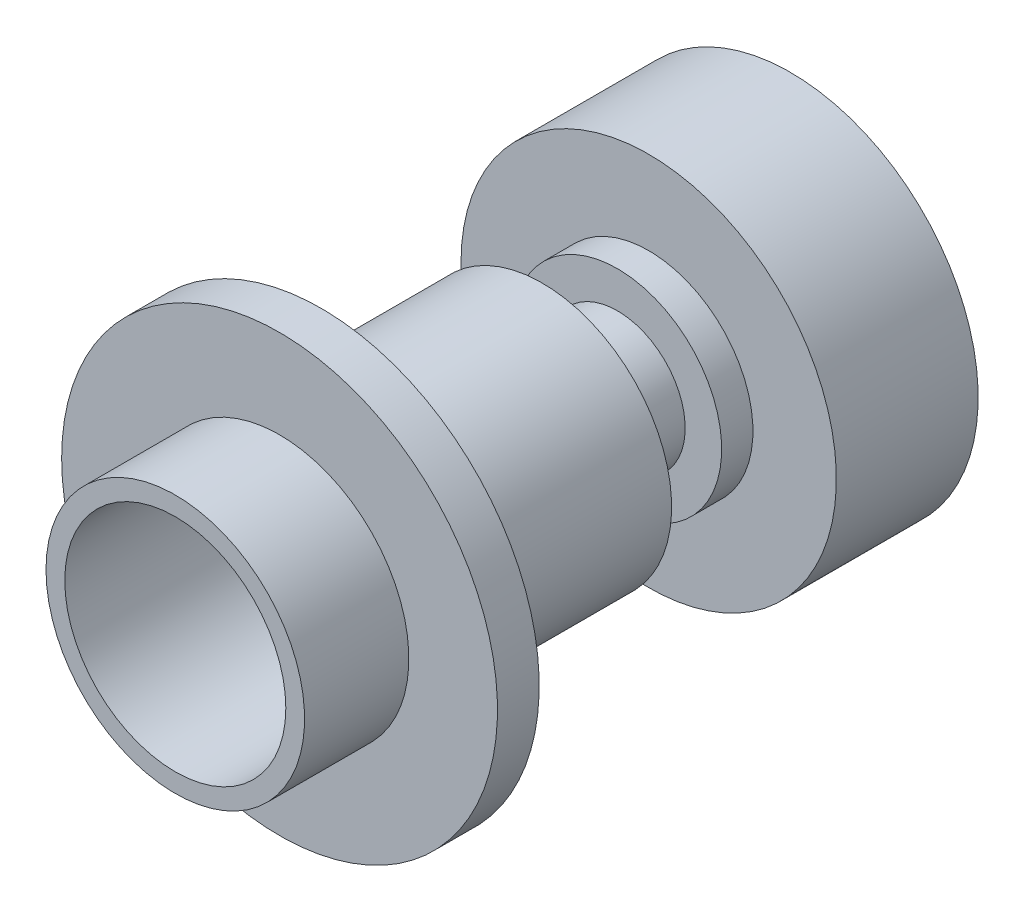
ISO-10303-21;
HEADER;
FILE_DESCRIPTION(('STEP AP214'),'2;1');
FILE_NAME('part.step','',(''),(''),'','','');
FILE_SCHEMA(('AUTOMOTIVE_DESIGN { 1 0 10303 214 1 1 1 1 }'));
ENDSEC;
DATA;
#1=APPLICATION_CONTEXT('core data for automotive mechanical design processes');
#2=APPLICATION_PROTOCOL_DEFINITION('international standard','automotive_design',2000,#1);
#3=PRODUCT_CONTEXT('',#1,'mechanical');
#4=PRODUCT('Part','Part','',(#3));
#5=PRODUCT_RELATED_PRODUCT_CATEGORY('part','',(#4));
#6=PRODUCT_DEFINITION_FORMATION('','',#4);
#7=PRODUCT_DEFINITION_CONTEXT('part definition',#1,'design');
#8=PRODUCT_DEFINITION('design','',#6,#7);
#9=PRODUCT_DEFINITION_SHAPE('','',#8);
#10=(LENGTH_UNIT() NAMED_UNIT(*) SI_UNIT(.MILLI.,.METRE.));
#11=(NAMED_UNIT(*) PLANE_ANGLE_UNIT() SI_UNIT($,.RADIAN.));
#12=(NAMED_UNIT(*) SI_UNIT($,.STERADIAN.) SOLID_ANGLE_UNIT());
#13=UNCERTAINTY_MEASURE_WITH_UNIT(LENGTH_MEASURE(1.E-05),#10,'distance_accuracy_value','');
#14=(GEOMETRIC_REPRESENTATION_CONTEXT(3) GLOBAL_UNCERTAINTY_ASSIGNED_CONTEXT((#13)) GLOBAL_UNIT_ASSIGNED_CONTEXT((#10,
#11,#12)) REPRESENTATION_CONTEXT('',''));
#15=CARTESIAN_POINT('',(0.,0.,0.));
#16=DIRECTION('',(0.,0.,1.));
#17=DIRECTION('',(1.,0.,0.));
#18=AXIS2_PLACEMENT_3D('',#15,#16,#17);
#19=CARTESIAN_POINT('',(2.5,0.,3.4));
#20=DIRECTION('',(0.,0.,1.));
#21=DIRECTION('',(1.,0.,0.));
#22=AXIS2_PLACEMENT_3D('',#19,#20,#21);
#23=PLANE('',#22);
#24=CARTESIAN_POINT('',(0.,0.,3.4));
#25=DIRECTION('',(0.,0.,-1.));
#26=DIRECTION('',(-1.,0.,0.));
#27=AXIS2_PLACEMENT_3D('',#24,#25,#26);
#28=CIRCLE('',#27,0.25);
#29=CARTESIAN_POINT('',(-0.25,0.,3.4));
#30=VERTEX_POINT('',#29);
#31=EDGE_CURVE('E73',#30,#30,#28,.T.);
#32=ORIENTED_EDGE('',*,*,#31,.F.);
#33=EDGE_LOOP('',(#32));
#34=FACE_BOUND('',#33,.T.);
#35=CARTESIAN_POINT('',(0.,0.,3.4));
#36=DIRECTION('',(0.,0.,-1.));
#37=DIRECTION('',(-1.,0.,0.));
#38=AXIS2_PLACEMENT_3D('',#35,#36,#37);
#39=CIRCLE('',#38,0.8);
#40=CARTESIAN_POINT('',(-0.799999999999999,0.,3.4));
#41=VERTEX_POINT('',#40);
#42=EDGE_CURVE('E91',#41,#41,#39,.T.);
#43=ORIENTED_EDGE('',*,*,#42,.T.);
#44=EDGE_LOOP('',(#43));
#45=FACE_BOUND('',#44,.T.);
#46=ADVANCED_FACE('F32',(#34,#45),#23,.F.);
#47=CARTESIAN_POINT('',(0.,0.,0.));
#48=DIRECTION('',(0.,0.,-1.));
#49=DIRECTION('',(-1.,0.,0.));
#50=AXIS2_PLACEMENT_3D('',#47,#48,#49);
#51=CYLINDRICAL_SURFACE('',#50,2.65);
#52=CARTESIAN_POINT('',(0.,0.,14.75));
#53=DIRECTION('',(0.,0.,-1.));
#54=DIRECTION('',(-1.,0.,0.));
#55=AXIS2_PLACEMENT_3D('',#52,#53,#54);
#56=CIRCLE('',#55,2.65);
#57=CARTESIAN_POINT('',(-2.65,0.,14.75));
#58=VERTEX_POINT('',#57);
#59=EDGE_CURVE('E10',#58,#58,#56,.T.);
#60=ORIENTED_EDGE('',*,*,#59,.F.);
#61=EDGE_LOOP('',(#60));
#62=FACE_BOUND('',#61,.T.);
#63=CARTESIAN_POINT('',(0.,0.,6.60505517197854));
#64=DIRECTION('',(0.,0.,-1.));
#65=DIRECTION('',(-1.,0.,0.));
#66=AXIS2_PLACEMENT_3D('',#63,#64,#65);
#67=CIRCLE('',#66,2.65);
#68=CARTESIAN_POINT('',(2.65,0.,6.60505517197854));
#69=VERTEX_POINT('',#68);
#70=EDGE_CURVE('E79',#69,#69,#67,.T.);
#71=ORIENTED_EDGE('',*,*,#70,.T.);
#72=EDGE_LOOP('',(#71));
#73=FACE_BOUND('',#72,.T.);
#74=ADVANCED_FACE('F34',(#62,#73),#51,.F.);
#75=CARTESIAN_POINT('',(2.65,0.,14.75));
#76=DIRECTION('',(0.,0.,-1.));
#77=DIRECTION('',(-1.,0.,0.));
#78=AXIS2_PLACEMENT_3D('',#75,#76,#77);
#79=PLANE('',#78);
#80=CARTESIAN_POINT('',(0.,0.,14.75));
#81=DIRECTION('',(0.,0.,-1.));
#82=DIRECTION('',(-1.,0.,0.));
#83=AXIS2_PLACEMENT_3D('',#80,#81,#82);
#84=CIRCLE('',#83,3.1);
#85=CARTESIAN_POINT('',(-3.1,0.,14.75));
#86=VERTEX_POINT('',#85);
#87=EDGE_CURVE('E39',#86,#86,#84,.T.);
#88=ORIENTED_EDGE('',*,*,#87,.F.);
#89=EDGE_LOOP('',(#88));
#90=FACE_BOUND('',#89,.T.);
#91=ORIENTED_EDGE('',*,*,#59,.T.);
#92=EDGE_LOOP('',(#91));
#93=FACE_BOUND('',#92,.T.);
#94=ADVANCED_FACE('F180',(#90,#93),#79,.F.);
#95=CARTESIAN_POINT('',(0.,0.,0.));
#96=DIRECTION('',(0.,0.,-1.));
#97=DIRECTION('',(-1.,0.,0.));
#98=AXIS2_PLACEMENT_3D('',#95,#96,#97);
#99=CYLINDRICAL_SURFACE('',#98,3.1);
#100=CARTESIAN_POINT('',(0.,0.,12.25));
#101=DIRECTION('',(0.,0.,-1.));
#102=DIRECTION('',(-1.,0.,0.));
#103=AXIS2_PLACEMENT_3D('',#100,#101,#102);
#104=CIRCLE('',#103,3.1);
#105=CARTESIAN_POINT('',(-3.1,0.,12.25));
#106=VERTEX_POINT('',#105);
#107=EDGE_CURVE('E43',#106,#106,#104,.T.);
#108=ORIENTED_EDGE('',*,*,#107,.F.);
#109=EDGE_LOOP('',(#108));
#110=FACE_BOUND('',#109,.T.);
#111=ORIENTED_EDGE('',*,*,#87,.T.);
#112=EDGE_LOOP('',(#111));
#113=FACE_BOUND('',#112,.T.);
#114=ADVANCED_FACE('F175',(#110,#113),#99,.T.);
#115=CARTESIAN_POINT('',(3.1,0.,12.25));
#116=DIRECTION('',(0.,0.,-1.));
#117=DIRECTION('',(-1.,0.,0.));
#118=AXIS2_PLACEMENT_3D('',#115,#116,#117);
#119=PLANE('',#118);
#120=CARTESIAN_POINT('',(0.,0.,12.25));
#121=DIRECTION('',(0.,0.,-1.));
#122=DIRECTION('',(-1.,0.,0.));
#123=AXIS2_PLACEMENT_3D('',#120,#121,#122);
#124=CIRCLE('',#123,5.225);
#125=CARTESIAN_POINT('',(-5.225,0.,12.25));
#126=VERTEX_POINT('',#125);
#127=EDGE_CURVE('E47',#126,#126,#124,.T.);
#128=ORIENTED_EDGE('',*,*,#127,.F.);
#129=EDGE_LOOP('',(#128));
#130=FACE_BOUND('',#129,.T.);
#131=ORIENTED_EDGE('',*,*,#107,.T.);
#132=EDGE_LOOP('',(#131));
#133=FACE_BOUND('',#132,.T.);
#134=ADVANCED_FACE('F169',(#130,#133),#119,.F.);
#135=CARTESIAN_POINT('',(0.,0.,0.));
#136=DIRECTION('',(0.,0.,-1.));
#137=DIRECTION('',(-1.,0.,0.));
#138=AXIS2_PLACEMENT_3D('',#135,#136,#137);
#139=CYLINDRICAL_SURFACE('',#138,5.225);
#140=CARTESIAN_POINT('',(0.,0.,11.25));
#141=DIRECTION('',(0.,0.,-1.));
#142=DIRECTION('',(-1.,0.,0.));
#143=AXIS2_PLACEMENT_3D('',#140,#141,#142);
#144=CIRCLE('',#143,5.225);
#145=CARTESIAN_POINT('',(-5.225,0.,11.25));
#146=VERTEX_POINT('',#145);
#147=EDGE_CURVE('E52',#146,#146,#144,.T.);
#148=ORIENTED_EDGE('',*,*,#147,.F.);
#149=EDGE_LOOP('',(#148));
#150=FACE_BOUND('',#149,.T.);
#151=ORIENTED_EDGE('',*,*,#127,.T.);
#152=EDGE_LOOP('',(#151));
#153=FACE_BOUND('',#152,.T.);
#154=ADVANCED_FACE('F163',(#150,#153),#139,.T.);
#155=CARTESIAN_POINT('',(5.225,0.,11.25));
#156=DIRECTION('',(0.,0.,1.));
#157=DIRECTION('',(1.,0.,0.));
#158=AXIS2_PLACEMENT_3D('',#155,#156,#157);
#159=PLANE('',#158);
#160=CARTESIAN_POINT('',(0.,0.,11.25));
#161=DIRECTION('',(0.,0.,-1.));
#162=DIRECTION('',(-1.,0.,0.));
#163=AXIS2_PLACEMENT_3D('',#160,#161,#162);
#164=CIRCLE('',#163,3.1);
#165=CARTESIAN_POINT('',(-3.1,0.,11.25));
#166=VERTEX_POINT('',#165);
#167=EDGE_CURVE('E55',#166,#166,#164,.T.);
#168=ORIENTED_EDGE('',*,*,#167,.F.);
#169=EDGE_LOOP('',(#168));
#170=FACE_BOUND('',#169,.T.);
#171=ORIENTED_EDGE('',*,*,#147,.T.);
#172=EDGE_LOOP('',(#171));
#173=FACE_BOUND('',#172,.T.);
#174=ADVANCED_FACE('F157',(#170,#173),#159,.F.);
#175=CARTESIAN_POINT('',(0.,0.,0.));
#176=DIRECTION('',(0.,0.,-1.));
#177=DIRECTION('',(-1.,0.,0.));
#178=AXIS2_PLACEMENT_3D('',#175,#176,#177);
#179=CYLINDRICAL_SURFACE('',#178,3.1);
#180=CARTESIAN_POINT('',(0.,0.,5.95));
#181=DIRECTION('',(0.,0.,-1.));
#182=DIRECTION('',(-1.,0.,0.));
#183=AXIS2_PLACEMENT_3D('',#180,#181,#182);
#184=CIRCLE('',#183,3.1);
#185=CARTESIAN_POINT('',(-3.1,0.,5.95));
#186=VERTEX_POINT('',#185);
#187=EDGE_CURVE('E58',#186,#186,#184,.T.);
#188=ORIENTED_EDGE('',*,*,#187,.F.);
#189=EDGE_LOOP('',(#188));
#190=FACE_BOUND('',#189,.T.);
#191=ORIENTED_EDGE('',*,*,#167,.T.);
#192=EDGE_LOOP('',(#191));
#193=FACE_BOUND('',#192,.T.);
#194=ADVANCED_FACE('F151',(#190,#193),#179,.T.);
#195=CARTESIAN_POINT('',(0.,0.,5.95));
#196=DIRECTION('',(0.,0.,1.));
#197=DIRECTION('',(1.,0.,0.));
#198=AXIS2_PLACEMENT_3D('',#195,#196,#197);
#199=CONICAL_SURFACE('',#198,3.1,1.30597899688911);
#200=CARTESIAN_POINT('',(0.,0.,5.55));
#201=DIRECTION('',(0.,0.,-1.));
#202=DIRECTION('',(-1.,0.,0.));
#203=AXIS2_PLACEMENT_3D('',#200,#201,#202);
#204=CIRCLE('',#203,1.625);
#205=CARTESIAN_POINT('',(-1.625,0.,5.55));
#206=VERTEX_POINT('',#205);
#207=EDGE_CURVE('E61',#206,#206,#204,.T.);
#208=ORIENTED_EDGE('',*,*,#207,.F.);
#209=EDGE_LOOP('',(#208));
#210=FACE_BOUND('',#209,.T.);
#211=ORIENTED_EDGE('',*,*,#187,.T.);
#212=EDGE_LOOP('',(#211));
#213=FACE_BOUND('',#212,.T.);
#214=ADVANCED_FACE('F145',(#210,#213),#199,.T.);
#215=CARTESIAN_POINT('',(0.,0.,0.));
#216=DIRECTION('',(0.,0.,-1.));
#217=DIRECTION('',(-1.,0.,0.));
#218=AXIS2_PLACEMENT_3D('',#215,#216,#217);
#219=CYLINDRICAL_SURFACE('',#218,1.625);
#220=CARTESIAN_POINT('',(0.,0.,4.15));
#221=DIRECTION('',(0.,0.,-1.));
#222=DIRECTION('',(-1.,0.,0.));
#223=AXIS2_PLACEMENT_3D('',#220,#221,#222);
#224=CIRCLE('',#223,1.625);
#225=CARTESIAN_POINT('',(-1.625,0.,4.15));
#226=VERTEX_POINT('',#225);
#227=EDGE_CURVE('E64',#226,#226,#224,.T.);
#228=ORIENTED_EDGE('',*,*,#227,.F.);
#229=EDGE_LOOP('',(#228));
#230=FACE_BOUND('',#229,.T.);
#231=ORIENTED_EDGE('',*,*,#207,.T.);
#232=EDGE_LOOP('',(#231));
#233=FACE_BOUND('',#232,.T.);
#234=ADVANCED_FACE('F139',(#230,#233),#219,.T.);
#235=CARTESIAN_POINT('',(1.625,0.,4.15));
#236=DIRECTION('',(0.,0.,-1.));
#237=DIRECTION('',(-1.,0.,0.));
#238=AXIS2_PLACEMENT_3D('',#235,#236,#237);
#239=PLANE('',#238);
#240=CARTESIAN_POINT('',(0.,0.,4.15));
#241=DIRECTION('',(0.,0.,-1.));
#242=DIRECTION('',(-1.,0.,0.));
#243=AXIS2_PLACEMENT_3D('',#240,#241,#242);
#244=CIRCLE('',#243,2.5);
#245=CARTESIAN_POINT('',(-2.5,0.,4.15));
#246=VERTEX_POINT('',#245);
#247=EDGE_CURVE('E67',#246,#246,#244,.T.);
#248=ORIENTED_EDGE('',*,*,#247,.F.);
#249=EDGE_LOOP('',(#248));
#250=FACE_BOUND('',#249,.T.);
#251=ORIENTED_EDGE('',*,*,#227,.T.);
#252=EDGE_LOOP('',(#251));
#253=FACE_BOUND('',#252,.T.);
#254=ADVANCED_FACE('F133',(#250,#253),#239,.F.);
#255=CARTESIAN_POINT('',(0.,0.,0.));
#256=DIRECTION('',(0.,0.,-1.));
#257=DIRECTION('',(-1.,0.,0.));
#258=AXIS2_PLACEMENT_3D('',#255,#256,#257);
#259=CYLINDRICAL_SURFACE('',#258,2.5);
#260=CARTESIAN_POINT('',(0.,0.,3.4));
#261=DIRECTION('',(0.,0.,-1.));
#262=DIRECTION('',(-1.,0.,0.));
#263=AXIS2_PLACEMENT_3D('',#260,#261,#262);
#264=CIRCLE('',#263,2.5);
#265=CARTESIAN_POINT('',(-2.5,0.,3.4));
#266=VERTEX_POINT('',#265);
#267=EDGE_CURVE('E70',#266,#266,#264,.T.);
#268=ORIENTED_EDGE('',*,*,#267,.F.);
#269=EDGE_LOOP('',(#268));
#270=FACE_BOUND('',#269,.T.);
#271=ORIENTED_EDGE('',*,*,#247,.T.);
#272=EDGE_LOOP('',(#271));
#273=FACE_BOUND('',#272,.T.);
#274=ADVANCED_FACE('F129',(#270,#273),#259,.T.);
#275=CARTESIAN_POINT('',(0.,0.,0.));
#276=DIRECTION('',(0.,0.,-1.));
#277=DIRECTION('',(-1.,0.,0.));
#278=AXIS2_PLACEMENT_3D('',#275,#276,#277);
#279=CYLINDRICAL_SURFACE('',#278,0.25);
#280=CARTESIAN_POINT('',(0.,0.,5.95420771435142));
#281=DIRECTION('',(0.,0.,-1.));
#282=DIRECTION('',(-1.,0.,0.));
#283=AXIS2_PLACEMENT_3D('',#280,#281,#282);
#284=CIRCLE('',#283,0.25);
#285=CARTESIAN_POINT('',(0.249999999999999,0.,5.95420771435142));
#286=VERTEX_POINT('',#285);
#287=EDGE_CURVE('E76',#286,#286,#284,.T.);
#288=ORIENTED_EDGE('',*,*,#287,.F.);
#289=EDGE_LOOP('',(#288));
#290=FACE_BOUND('',#289,.T.);
#291=ORIENTED_EDGE('',*,*,#31,.T.);
#292=EDGE_LOOP('',(#291));
#293=FACE_BOUND('',#292,.T.);
#294=ADVANCED_FACE('F132',(#290,#293),#279,.F.);
#295=CARTESIAN_POINT('',(0.,0.,5.95420771435142));
#296=DIRECTION('',(0.,0.,1.));
#297=DIRECTION('',(1.,0.,0.));
#298=AXIS2_PLACEMENT_3D('',#295,#296,#297);
#299=CONICAL_SURFACE('',#298,0.25,1.30597899688911);
#300=CARTESIAN_POINT('',(2.65,0.,6.60505517197854));
#301=CARTESIAN_POINT('',(2.625,0.,6.59827551096159));
#302=CARTESIAN_POINT('',(2.6,0.,6.59149584994464));
#303=CARTESIAN_POINT('',(2.55,0.,6.57793652791074));
#304=CARTESIAN_POINT('',(2.525,0.,6.57115686689379));
#305=CARTESIAN_POINT('',(2.475,0.,6.55759754485989));
#306=CARTESIAN_POINT('',(2.45,0.,6.55081788384294));
#307=CARTESIAN_POINT('',(2.4,0.,6.53725856180904));
#308=CARTESIAN_POINT('',(2.375,0.,6.5304789007921));
#309=CARTESIAN_POINT('',(2.325,0.,6.5169195787582));
#310=CARTESIAN_POINT('',(2.3,0.,6.51013991774125));
#311=CARTESIAN_POINT('',(2.25,0.,6.49658059570735));
#312=CARTESIAN_POINT('',(2.225,0.,6.4898009346904));
#313=CARTESIAN_POINT('',(2.175,0.,6.4762416126565));
#314=CARTESIAN_POINT('',(2.15,0.,6.46946195163955));
#315=CARTESIAN_POINT('',(2.1,0.,6.45590262960565));
#316=CARTESIAN_POINT('',(2.075,0.,6.4491229685887));
#317=CARTESIAN_POINT('',(2.025,0.,6.43556364655481));
#318=CARTESIAN_POINT('',(2.,0.,6.42878398553786));
#319=CARTESIAN_POINT('',(1.95,0.,6.41522466350396));
#320=CARTESIAN_POINT('',(1.925,0.,6.40844500248701));
#321=CARTESIAN_POINT('',(1.875,0.,6.39488568045311));
#322=CARTESIAN_POINT('',(1.85,0.,6.38810601943616));
#323=CARTESIAN_POINT('',(1.8,0.,6.37454669740226));
#324=CARTESIAN_POINT('',(1.775,0.,6.36776703638531));
#325=CARTESIAN_POINT('',(1.725,0.,6.35420771435142));
#326=CARTESIAN_POINT('',(1.7,0.,6.34742805333447));
#327=CARTESIAN_POINT('',(1.65,0.,6.33386873130057));
#328=CARTESIAN_POINT('',(1.625,0.,6.32708907028362));
#329=CARTESIAN_POINT('',(1.575,0.,6.31352974824972));
#330=CARTESIAN_POINT('',(1.55,0.,6.30675008723277));
#331=CARTESIAN_POINT('',(1.5,0.,6.29319076519887));
#332=CARTESIAN_POINT('',(1.475,0.,6.28641110418192));
#333=CARTESIAN_POINT('',(1.425,0.,6.27285178214803));
#334=CARTESIAN_POINT('',(1.4,0.,6.26607212113108));
#335=CARTESIAN_POINT('',(1.35,0.,6.25251279909718));
#336=CARTESIAN_POINT('',(1.325,0.,6.24573313808023));
#337=CARTESIAN_POINT('',(1.275,0.,6.23217381604633));
#338=CARTESIAN_POINT('',(1.25,0.,6.22539415502938));
#339=CARTESIAN_POINT('',(1.2,0.,6.21183483299548));
#340=CARTESIAN_POINT('',(1.175,0.,6.20505517197854));
#341=CARTESIAN_POINT('',(1.125,0.,6.19149584994464));
#342=CARTESIAN_POINT('',(1.1,0.,6.18471618892769));
#343=CARTESIAN_POINT('',(1.05,0.,6.17115686689379));
#344=CARTESIAN_POINT('',(1.025,0.,6.16437720587684));
#345=CARTESIAN_POINT('',(0.974999999999999,0.,6.15081788384294));
#346=CARTESIAN_POINT('',(0.949999999999999,0.,6.14403822282599));
#347=CARTESIAN_POINT('',(0.899999999999999,0.,6.13047890079209));
#348=CARTESIAN_POINT('',(0.874999999999999,0.,6.12369923977514));
#349=CARTESIAN_POINT('',(0.824999999999999,0.,6.11013991774125));
#350=CARTESIAN_POINT('',(0.799999999999999,0.,6.1033602567243));
#351=CARTESIAN_POINT('',(0.749999999999999,0.,6.0898009346904));
#352=CARTESIAN_POINT('',(0.724999999999999,0.,6.08302127367345));
#353=CARTESIAN_POINT('',(0.674999999999999,0.,6.06946195163955));
#354=CARTESIAN_POINT('',(0.649999999999999,0.,6.0626822906226));
#355=CARTESIAN_POINT('',(0.599999999999999,0.,6.0491229685887));
#356=CARTESIAN_POINT('',(0.574999999999999,0.,6.04234330757176));
#357=CARTESIAN_POINT('',(0.524999999999999,0.,6.02878398553786));
#358=CARTESIAN_POINT('',(0.499999999999999,0.,6.02200432452091));
#359=CARTESIAN_POINT('',(0.449999999999999,0.,6.00844500248701));
#360=CARTESIAN_POINT('',(0.424999999999999,0.,6.00166534147006));
#361=CARTESIAN_POINT('',(0.374999999999999,0.,5.98810601943616));
#362=CARTESIAN_POINT('',(0.349999999999999,0.,5.98132635841921));
#363=CARTESIAN_POINT('',(0.299999999999999,0.,5.96776703638531));
#364=CARTESIAN_POINT('',(0.274999999999999,0.,5.96098737536837));
#365=CARTESIAN_POINT('',(0.249999999999999,0.,5.95420771435142));
#366=B_SPLINE_CURVE_WITH_KNOTS('',3,(#300,#301,#302,#303,#304,#305,#306,#307,#308,#309,#310,
#311,#312,#313,#314,#315,#316,#317,#318,#319,#320,#321,#322,#323,#324,#325,#326,#327,#328,#329,
#330,#331,#332,#333,#334,#335,#336,#337,#338,#339,#340,#341,#342,#343,#344,#345,#346,#347,#348,
#349,#350,#351,#352,#353,#354,#355,#356,#357,#358,#359,#360,#361,#362,#363,#364,#365),
.UNSPECIFIED.,.F.,.F.,(4,2,2,2,2,2,2,2,2,2,2,2,2,2,2,2,2,2,2,2,2,2,2,2,2,2,2,2,2,2,2,2,4),(0.,
0.0777089070283618,0.155417814056725,0.233126721085087,0.310835628113449,0.388544535141811,
0.466253442170174,0.543962349198536,0.621671256226898,0.69938016325526,0.777089070283623,
0.854797977311986,0.932506884340348,1.01021579136871,1.08792469839707,1.16563360542544,
1.2433425124538,1.32105141948216,1.39876032651052,1.47646923353888,1.55417814056725,
1.63188704759561,1.70959595462397,1.78730486165233,1.8650137686807,1.94272267570906,
2.02043158273742,2.09814048976578,2.17584939679415,2.25355830382251,2.33126721085087,
2.40897611787923,2.48668502490759),.UNSPECIFIED.);
#367=EDGE_CURVE('BSEAM125',#69,#286,#366,.T.);
#368=ORIENTED_EDGE('',*,*,#70,.F.);
#369=ORIENTED_EDGE('',*,*,#287,.T.);
#370=ORIENTED_EDGE('',*,*,#367,.T.);
#371=ORIENTED_EDGE('',*,*,#367,.F.);
#372=EDGE_LOOP('',(#368,#370,#369,#371));
#373=FACE_BOUND('',#372,.T.);
#374=ADVANCED_FACE('F125',(#373),#299,.F.);
#375=CARTESIAN_POINT('',(4.5,0.,3.4));
#376=DIRECTION('',(0.,0.,-1.));
#377=DIRECTION('',(-1.,0.,0.));
#378=AXIS2_PLACEMENT_3D('',#375,#376,#377);
#379=PLANE('',#378);
#380=CARTESIAN_POINT('',(0.,0.,3.4));
#381=DIRECTION('',(0.,0.,-1.));
#382=DIRECTION('',(-1.,0.,0.));
#383=AXIS2_PLACEMENT_3D('',#380,#381,#382);
#384=CIRCLE('',#383,4.5);
#385=CARTESIAN_POINT('',(-4.5,0.,3.4));
#386=VERTEX_POINT('',#385);
#387=EDGE_CURVE('E88',#386,#386,#384,.T.);
#388=ORIENTED_EDGE('',*,*,#387,.F.);
#389=EDGE_LOOP('',(#388));
#390=FACE_BOUND('',#389,.T.);
#391=ORIENTED_EDGE('',*,*,#267,.T.);
#392=EDGE_LOOP('',(#391));
#393=FACE_BOUND('',#392,.T.);
#394=ADVANCED_FACE('F107',(#390,#393),#379,.F.);
#395=CARTESIAN_POINT('',(0.,0.,0.));
#396=DIRECTION('',(0.,0.,-1.));
#397=DIRECTION('',(-1.,0.,0.));
#398=AXIS2_PLACEMENT_3D('',#395,#396,#397);
#399=CYLINDRICAL_SURFACE('',#398,3.75);
#400=CARTESIAN_POINT('',(0.,0.,2.65));
#401=DIRECTION('',(0.,0.,-1.));
#402=DIRECTION('',(-1.,0.,0.));
#403=AXIS2_PLACEMENT_3D('',#400,#401,#402);
#404=CIRCLE('',#403,3.75);
#405=CARTESIAN_POINT('',(-3.75,0.,2.65));
#406=VERTEX_POINT('',#405);
#407=EDGE_CURVE('E97',#406,#406,#404,.T.);
#408=ORIENTED_EDGE('',*,*,#407,.F.);
#409=EDGE_LOOP('',(#408));
#410=FACE_BOUND('',#409,.T.);
#411=CARTESIAN_POINT('',(0.,0.,0.));
#412=DIRECTION('',(0.,0.,-1.));
#413=DIRECTION('',(-1.,0.,0.));
#414=AXIS2_PLACEMENT_3D('',#411,#412,#413);
#415=CIRCLE('',#414,3.75);
#416=CARTESIAN_POINT('',(-3.75,0.,0.));
#417=VERTEX_POINT('',#416);
#418=EDGE_CURVE('E82',#417,#417,#415,.T.);
#419=ORIENTED_EDGE('',*,*,#418,.T.);
#420=EDGE_LOOP('',(#419));
#421=FACE_BOUND('',#420,.T.);
#422=ADVANCED_FACE('F103',(#410,#421),#399,.F.);
#423=CARTESIAN_POINT('',(3.75,0.,0.));
#424=DIRECTION('',(0.,0.,1.));
#425=DIRECTION('',(1.,0.,0.));
#426=AXIS2_PLACEMENT_3D('',#423,#424,#425);
#427=PLANE('',#426);
#428=ORIENTED_EDGE('',*,*,#418,.F.);
#429=EDGE_LOOP('',(#428));
#430=FACE_BOUND('',#429,.T.);
#431=CARTESIAN_POINT('',(0.,0.,0.));
#432=DIRECTION('',(0.,0.,-1.));
#433=DIRECTION('',(-1.,0.,0.));
#434=AXIS2_PLACEMENT_3D('',#431,#432,#433);
#435=CIRCLE('',#434,4.5);
#436=CARTESIAN_POINT('',(-4.5,0.,0.));
#437=VERTEX_POINT('',#436);
#438=EDGE_CURVE('E85',#437,#437,#435,.T.);
#439=ORIENTED_EDGE('',*,*,#438,.T.);
#440=EDGE_LOOP('',(#439));
#441=FACE_BOUND('',#440,.T.);
#442=ADVANCED_FACE('F106',(#430,#441),#427,.F.);
#443=CARTESIAN_POINT('',(0.,0.,0.));
#444=DIRECTION('',(0.,0.,-1.));
#445=DIRECTION('',(-1.,0.,0.));
#446=AXIS2_PLACEMENT_3D('',#443,#444,#445);
#447=CYLINDRICAL_SURFACE('',#446,4.5);
#448=ORIENTED_EDGE('',*,*,#438,.F.);
#449=EDGE_LOOP('',(#448));
#450=FACE_BOUND('',#449,.T.);
#451=ORIENTED_EDGE('',*,*,#387,.T.);
#452=EDGE_LOOP('',(#451));
#453=FACE_BOUND('',#452,.T.);
#454=ADVANCED_FACE('F113',(#450,#453),#447,.T.);
#455=CARTESIAN_POINT('',(0.,0.,0.));
#456=DIRECTION('',(0.,0.,-1.));
#457=DIRECTION('',(-1.,0.,0.));
#458=AXIS2_PLACEMENT_3D('',#455,#456,#457);
#459=CYLINDRICAL_SURFACE('',#458,0.8);
#460=ORIENTED_EDGE('',*,*,#42,.F.);
#461=EDGE_LOOP('',(#460));
#462=FACE_BOUND('',#461,.T.);
#463=CARTESIAN_POINT('',(0.,0.,2.65));
#464=DIRECTION('',(0.,0.,-1.));
#465=DIRECTION('',(-1.,0.,0.));
#466=AXIS2_PLACEMENT_3D('',#463,#464,#465);
#467=CIRCLE('',#466,0.8);
#468=CARTESIAN_POINT('',(-0.799999999999999,0.,2.65));
#469=VERTEX_POINT('',#468);
#470=EDGE_CURVE('E94',#469,#469,#467,.T.);
#471=ORIENTED_EDGE('',*,*,#470,.T.);
#472=EDGE_LOOP('',(#471));
#473=FACE_BOUND('',#472,.T.);
#474=ADVANCED_FACE('F119',(#462,#473),#459,.F.);
#475=CARTESIAN_POINT('',(0.8,0.,2.65));
#476=DIRECTION('',(0.,0.,1.));
#477=DIRECTION('',(1.,0.,0.));
#478=AXIS2_PLACEMENT_3D('',#475,#476,#477);
#479=PLANE('',#478);
#480=ORIENTED_EDGE('',*,*,#470,.F.);
#481=EDGE_LOOP('',(#480));
#482=FACE_BOUND('',#481,.T.);
#483=ORIENTED_EDGE('',*,*,#407,.T.);
#484=EDGE_LOOP('',(#483));
#485=FACE_BOUND('',#484,.T.);
#486=ADVANCED_FACE('F101',(#482,#485),#479,.F.);
#487=CLOSED_SHELL('',(#46,#74,#94,#114,#134,#154,#174,#194,#214,#234,#254,#274,#294,#374,#394,
#422,#442,#454,#474,#486));
#488=MANIFOLD_SOLID_BREP('B2',#487);
#489=ADVANCED_BREP_SHAPE_REPRESENTATION('',(#18,#488),#14);
#490=SHAPE_DEFINITION_REPRESENTATION(#9,#489);
ENDSEC;
END-ISO-10303-21;
